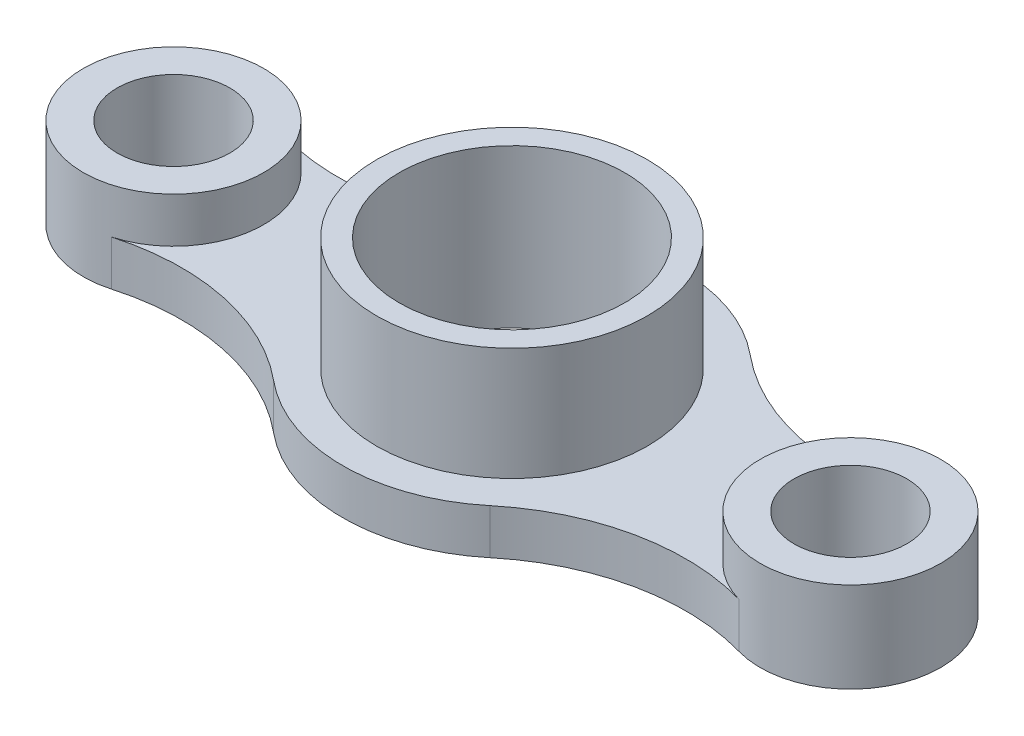
ISO-10303-21;
HEADER;
FILE_DESCRIPTION(('STEP AP214'),'2;1');
FILE_NAME('part.step','',(''),(''),'','','');
FILE_SCHEMA(('AUTOMOTIVE_DESIGN { 1 0 10303 214 1 1 1 1 }'));
ENDSEC;
DATA;
#1=APPLICATION_CONTEXT('core data for automotive mechanical design processes');
#2=APPLICATION_PROTOCOL_DEFINITION('international standard','automotive_design',2000,#1);
#3=PRODUCT_CONTEXT('',#1,'mechanical');
#4=PRODUCT('Part','Part','',(#3));
#5=PRODUCT_RELATED_PRODUCT_CATEGORY('part','',(#4));
#6=PRODUCT_DEFINITION_FORMATION('','',#4);
#7=PRODUCT_DEFINITION_CONTEXT('part definition',#1,'design');
#8=PRODUCT_DEFINITION('design','',#6,#7);
#9=PRODUCT_DEFINITION_SHAPE('','',#8);
#10=(LENGTH_UNIT() NAMED_UNIT(*) SI_UNIT(.MILLI.,.METRE.));
#11=(NAMED_UNIT(*) PLANE_ANGLE_UNIT() SI_UNIT($,.RADIAN.));
#12=(NAMED_UNIT(*) SI_UNIT($,.STERADIAN.) SOLID_ANGLE_UNIT());
#13=UNCERTAINTY_MEASURE_WITH_UNIT(LENGTH_MEASURE(1.E-05),#10,'distance_accuracy_value','');
#14=(GEOMETRIC_REPRESENTATION_CONTEXT(3) GLOBAL_UNCERTAINTY_ASSIGNED_CONTEXT((#13)) GLOBAL_UNIT_ASSIGNED_CONTEXT((#10,
#11,#12)) REPRESENTATION_CONTEXT('',''));
#15=CARTESIAN_POINT('',(0.,0.,0.));
#16=DIRECTION('',(0.,0.,1.));
#17=DIRECTION('',(1.,0.,0.));
#18=AXIS2_PLACEMENT_3D('',#15,#16,#17);
#19=CARTESIAN_POINT('',(-55.875,20.,-67.3367238214037));
#20=DIRECTION('',(0.,1.,0.));
#21=DIRECTION('',(0.,0.,1.));
#22=AXIS2_PLACEMENT_3D('',#19,#20,#21);
#23=PLANE('',#22);
#24=CARTESIAN_POINT('',(150.,20.,0.));
#25=DIRECTION('',(0.,-1.,0.));
#26=DIRECTION('',(0.,0.,1.));
#27=AXIS2_PLACEMENT_3D('',#24,#25,#26);
#28=CIRCLE('',#27,40.);
#29=CARTESIAN_POINT('',(139.071428571429,20.,38.478127897945));
#30=VERTEX_POINT('',#29);
#31=CARTESIAN_POINT('',(139.071428571429,20.,-38.478127897945));
#32=VERTEX_POINT('',#31);
#33=EDGE_CURVE('E341',#30,#32,#28,.T.);
#34=ORIENTED_EDGE('',*,*,#33,.T.);
#35=CARTESIAN_POINT('',(111.75,20.,-134.673447642807));
#36=DIRECTION('',(0.,-1.,0.));
#37=DIRECTION('',(0.,0.,-1.));
#38=AXIS2_PLACEMENT_3D('',#35,#36,#37);
#39=CIRCLE('',#38,100.);
#40=CARTESIAN_POINT('',(47.8928571428571,20.,-57.7171918469175));
#41=VERTEX_POINT('',#40);
#42=EDGE_CURVE('E220',#32,#41,#39,.T.);
#43=ORIENTED_EDGE('',*,*,#42,.T.);
#44=CARTESIAN_POINT('',(0.,20.,0.));
#45=DIRECTION('',(0.,1.,0.));
#46=DIRECTION('',(0.,0.,1.));
#47=AXIS2_PLACEMENT_3D('',#44,#45,#46);
#48=CIRCLE('',#47,75.);
#49=CARTESIAN_POINT('',(-47.8928571428571,20.,-57.7171918469175));
#50=VERTEX_POINT('',#49);
#51=EDGE_CURVE('E183',#41,#50,#48,.T.);
#52=ORIENTED_EDGE('',*,*,#51,.T.);
#53=CARTESIAN_POINT('',(-111.75,20.,-134.673447642807));
#54=DIRECTION('',(0.,1.,0.));
#55=DIRECTION('',(0.,0.,1.));
#56=AXIS2_PLACEMENT_3D('',#53,#54,#55);
#57=CIRCLE('',#56,100.);
#58=CARTESIAN_POINT('',(-139.071428571429,20.,-38.478127897945));
#59=VERTEX_POINT('',#58);
#60=EDGE_CURVE('E243',#59,#50,#57,.T.);
#61=ORIENTED_EDGE('',*,*,#60,.F.);
#62=CARTESIAN_POINT('',(-150.,20.,0.));
#63=DIRECTION('',(0.,1.,0.));
#64=DIRECTION('',(0.,0.,1.));
#65=AXIS2_PLACEMENT_3D('',#62,#63,#64);
#66=CIRCLE('',#65,40.);
#67=CARTESIAN_POINT('',(-139.071428571429,20.,38.478127897945));
#68=VERTEX_POINT('',#67);
#69=EDGE_CURVE('E264',#68,#59,#66,.T.);
#70=ORIENTED_EDGE('',*,*,#69,.F.);
#71=CARTESIAN_POINT('',(-111.75,20.,134.673447642807));
#72=DIRECTION('',(0.,-1.,0.));
#73=DIRECTION('',(0.,0.,-1.));
#74=AXIS2_PLACEMENT_3D('',#71,#72,#73);
#75=CIRCLE('',#74,100.);
#76=CARTESIAN_POINT('',(-47.8928571428571,20.,57.7171918469175));
#77=VERTEX_POINT('',#76);
#78=EDGE_CURVE('E202',#68,#77,#75,.T.);
#79=ORIENTED_EDGE('',*,*,#78,.T.);
#80=CARTESIAN_POINT('',(0.,20.,0.));
#81=DIRECTION('',(0.,1.,0.));
#82=DIRECTION('',(0.,0.,1.));
#83=AXIS2_PLACEMENT_3D('',#80,#81,#82);
#84=CIRCLE('',#83,75.);
#85=CARTESIAN_POINT('',(47.8928571428571,20.,57.7171918469175));
#86=VERTEX_POINT('',#85);
#87=EDGE_CURVE('E194',#77,#86,#84,.T.);
#88=ORIENTED_EDGE('',*,*,#87,.T.);
#89=CARTESIAN_POINT('',(111.75,20.,134.673447642807));
#90=DIRECTION('',(0.,1.,0.));
#91=DIRECTION('',(0.,0.,1.));
#92=AXIS2_PLACEMENT_3D('',#89,#90,#91);
#93=CIRCLE('',#92,100.);
#94=EDGE_CURVE('E199',#30,#86,#93,.T.);
#95=ORIENTED_EDGE('',*,*,#94,.F.);
#96=EDGE_LOOP('',(#34,#43,#52,#61,#70,#79,#88,#95));
#97=FACE_BOUND('',#96,.T.);
#98=CARTESIAN_POINT('',(0.,20.,0.));
#99=DIRECTION('',(0.,1.,0.));
#100=DIRECTION('',(0.,0.,1.));
#101=AXIS2_PLACEMENT_3D('',#98,#99,#100);
#102=CIRCLE('',#101,60.);
#103=CARTESIAN_POINT('',(0.,20.,60.));
#104=VERTEX_POINT('',#103);
#105=EDGE_CURVE('E230',#104,#104,#102,.T.);
#106=ORIENTED_EDGE('',*,*,#105,.F.);
#107=EDGE_LOOP('',(#106));
#108=FACE_BOUND('',#107,.T.);
#109=ADVANCED_FACE('F126',(#97,#108),#23,.T.);
#110=CARTESIAN_POINT('',(-55.875,0.,-67.3367238214037));
#111=DIRECTION('',(0.,1.,0.));
#112=DIRECTION('',(0.,0.,1.));
#113=AXIS2_PLACEMENT_3D('',#110,#111,#112);
#114=PLANE('',#113);
#115=CARTESIAN_POINT('',(150.,0.,0.));
#116=DIRECTION('',(0.,-1.,0.));
#117=DIRECTION('',(0.,0.,-1.));
#118=AXIS2_PLACEMENT_3D('',#115,#116,#117);
#119=CIRCLE('',#118,25.);
#120=CARTESIAN_POINT('',(150.,0.,-25.));
#121=VERTEX_POINT('',#120);
#122=EDGE_CURVE('E287',#121,#121,#119,.T.);
#123=ORIENTED_EDGE('',*,*,#122,.F.);
#124=EDGE_LOOP('',(#123));
#125=FACE_BOUND('',#124,.T.);
#126=CARTESIAN_POINT('',(-111.75,0.,-134.673447642807));
#127=DIRECTION('',(0.,1.,0.));
#128=DIRECTION('',(0.,0.,1.));
#129=AXIS2_PLACEMENT_3D('',#126,#127,#128);
#130=CIRCLE('',#129,100.);
#131=CARTESIAN_POINT('',(-139.071428571429,0.,-38.478127897945));
#132=VERTEX_POINT('',#131);
#133=CARTESIAN_POINT('',(-47.8928571428571,0.,-57.7171918469175));
#134=VERTEX_POINT('',#133);
#135=EDGE_CURVE('E226',#132,#134,#130,.T.);
#136=ORIENTED_EDGE('',*,*,#135,.T.);
#137=CARTESIAN_POINT('',(0.,0.,0.));
#138=DIRECTION('',(0.,1.,0.));
#139=DIRECTION('',(0.,0.,1.));
#140=AXIS2_PLACEMENT_3D('',#137,#138,#139);
#141=CIRCLE('',#140,75.);
#142=CARTESIAN_POINT('',(47.8928571428571,0.,-57.7171918469175));
#143=VERTEX_POINT('',#142);
#144=EDGE_CURVE('E229',#143,#134,#141,.T.);
#145=ORIENTED_EDGE('',*,*,#144,.F.);
#146=CARTESIAN_POINT('',(111.75,0.,-134.673447642807));
#147=DIRECTION('',(0.,-1.,0.));
#148=DIRECTION('',(0.,0.,-1.));
#149=AXIS2_PLACEMENT_3D('',#146,#147,#148);
#150=CIRCLE('',#149,100.);
#151=CARTESIAN_POINT('',(139.071428571429,0.,-38.478127897945));
#152=VERTEX_POINT('',#151);
#153=EDGE_CURVE('E233',#152,#143,#150,.T.);
#154=ORIENTED_EDGE('',*,*,#153,.F.);
#155=CARTESIAN_POINT('',(150.,0.,0.));
#156=DIRECTION('',(0.,-1.,0.));
#157=DIRECTION('',(0.,0.,-1.));
#158=AXIS2_PLACEMENT_3D('',#155,#156,#157);
#159=CIRCLE('',#158,40.);
#160=CARTESIAN_POINT('',(139.071428571429,0.,38.478127897945));
#161=VERTEX_POINT('',#160);
#162=EDGE_CURVE('E235',#152,#161,#159,.T.);
#163=ORIENTED_EDGE('',*,*,#162,.T.);
#164=CARTESIAN_POINT('',(111.75,0.,134.673447642807));
#165=DIRECTION('',(0.,1.,0.));
#166=DIRECTION('',(0.,0.,1.));
#167=AXIS2_PLACEMENT_3D('',#164,#165,#166);
#168=CIRCLE('',#167,100.);
#169=CARTESIAN_POINT('',(47.8928571428571,0.,57.7171918469175));
#170=VERTEX_POINT('',#169);
#171=EDGE_CURVE('E238',#161,#170,#168,.T.);
#172=ORIENTED_EDGE('',*,*,#171,.T.);
#173=CARTESIAN_POINT('',(0.,0.,0.));
#174=DIRECTION('',(0.,1.,0.));
#175=DIRECTION('',(0.,0.,1.));
#176=AXIS2_PLACEMENT_3D('',#173,#174,#175);
#177=CIRCLE('',#176,75.);
#178=CARTESIAN_POINT('',(-47.8928571428571,0.,57.7171918469175));
#179=VERTEX_POINT('',#178);
#180=EDGE_CURVE('E211',#179,#170,#177,.T.);
#181=ORIENTED_EDGE('',*,*,#180,.F.);
#182=CARTESIAN_POINT('',(-111.75,0.,134.673447642807));
#183=DIRECTION('',(0.,-1.,0.));
#184=DIRECTION('',(0.,0.,-1.));
#185=AXIS2_PLACEMENT_3D('',#182,#183,#184);
#186=CIRCLE('',#185,100.);
#187=CARTESIAN_POINT('',(-139.071428571429,0.,38.478127897945));
#188=VERTEX_POINT('',#187);
#189=EDGE_CURVE('E241',#188,#179,#186,.T.);
#190=ORIENTED_EDGE('',*,*,#189,.F.);
#191=CARTESIAN_POINT('',(-150.,0.,0.));
#192=DIRECTION('',(0.,1.,0.));
#193=DIRECTION('',(0.,0.,1.));
#194=AXIS2_PLACEMENT_3D('',#191,#192,#193);
#195=CIRCLE('',#194,40.);
#196=EDGE_CURVE('E173',#132,#188,#195,.T.);
#197=ORIENTED_EDGE('',*,*,#196,.F.);
#198=EDGE_LOOP('',(#136,#145,#154,#163,#172,#181,#190,#197));
#199=FACE_BOUND('',#198,.T.);
#200=CARTESIAN_POINT('',(-150.,0.,0.));
#201=DIRECTION('',(0.,1.,0.));
#202=DIRECTION('',(0.,0.,1.));
#203=AXIS2_PLACEMENT_3D('',#200,#201,#202);
#204=CIRCLE('',#203,25.);
#205=CARTESIAN_POINT('',(-150.,0.,25.));
#206=VERTEX_POINT('',#205);
#207=EDGE_CURVE('E284',#206,#206,#204,.T.);
#208=ORIENTED_EDGE('',*,*,#207,.T.);
#209=EDGE_LOOP('',(#208));
#210=FACE_BOUND('',#209,.T.);
#211=CARTESIAN_POINT('',(0.,0.,0.));
#212=DIRECTION('',(0.,1.,0.));
#213=DIRECTION('',(0.,0.,1.));
#214=AXIS2_PLACEMENT_3D('',#211,#212,#213);
#215=CIRCLE('',#214,50.);
#216=CARTESIAN_POINT('',(0.,0.,50.));
#217=VERTEX_POINT('',#216);
#218=EDGE_CURVE('E270',#217,#217,#215,.T.);
#219=ORIENTED_EDGE('',*,*,#218,.T.);
#220=EDGE_LOOP('',(#219));
#221=FACE_BOUND('',#220,.T.);
#222=ADVANCED_FACE('F257',(#125,#199,#210,#221),#114,.F.);
#223=CARTESIAN_POINT('',(-111.75,20.,-134.673447642807));
#224=DIRECTION('',(0.,-1.,0.));
#225=DIRECTION('',(0.,0.,-1.));
#226=AXIS2_PLACEMENT_3D('',#223,#224,#225);
#227=CYLINDRICAL_SURFACE('',#226,100.);
#228=ORIENTED_EDGE('',*,*,#135,.F.);
#229=DIRECTION('',(0.,-1.,0.));
#230=VECTOR('',#229,1.);
#231=CARTESIAN_POINT('',(-139.071428571429,20.,-38.478127897945));
#232=LINE('',#231,#230);
#233=EDGE_CURVE('E12',#59,#132,#232,.T.);
#234=ORIENTED_EDGE('',*,*,#233,.F.);
#235=ORIENTED_EDGE('',*,*,#60,.T.);
#236=DIRECTION('',(0.,-1.,0.));
#237=VECTOR('',#236,1.);
#238=CARTESIAN_POINT('',(-47.8928571428571,20.,-57.7171918469175));
#239=LINE('',#238,#237);
#240=EDGE_CURVE('E130',#50,#134,#239,.T.);
#241=ORIENTED_EDGE('',*,*,#240,.T.);
#242=EDGE_LOOP('',(#228,#234,#235,#241));
#243=FACE_BOUND('',#242,.T.);
#244=ADVANCED_FACE('F128',(#243),#227,.F.);
#245=CARTESIAN_POINT('',(-150.,20.,0.));
#246=DIRECTION('',(0.,-1.,0.));
#247=DIRECTION('',(0.,0.,-1.));
#248=AXIS2_PLACEMENT_3D('',#245,#246,#247);
#249=CYLINDRICAL_SURFACE('',#248,40.);
#250=ORIENTED_EDGE('',*,*,#196,.T.);
#251=DIRECTION('',(0.,-1.,0.));
#252=VECTOR('',#251,1.);
#253=CARTESIAN_POINT('',(-139.071428571429,20.,38.478127897945));
#254=LINE('',#253,#252);
#255=EDGE_CURVE('E136',#68,#188,#254,.T.);
#256=ORIENTED_EDGE('',*,*,#255,.F.);
#257=ORIENTED_EDGE('',*,*,#69,.T.);
#258=ORIENTED_EDGE('',*,*,#233,.T.);
#259=EDGE_LOOP('',(#250,#256,#257,#258));
#260=FACE_BOUND('',#259,.T.);
#261=CARTESIAN_POINT('',(-150.,40.,0.));
#262=DIRECTION('',(0.,1.,0.));
#263=DIRECTION('',(0.,0.,1.));
#264=AXIS2_PLACEMENT_3D('',#261,#262,#263);
#265=CIRCLE('',#264,40.);
#266=CARTESIAN_POINT('',(-150.,40.,40.));
#267=VERTEX_POINT('',#266);
#268=EDGE_CURVE('E266',#267,#267,#265,.T.);
#269=ORIENTED_EDGE('',*,*,#268,.F.);
#270=EDGE_LOOP('',(#269));
#271=FACE_BOUND('',#270,.T.);
#272=ADVANCED_FACE('F262',(#260,#271),#249,.T.);
#273=CARTESIAN_POINT('',(-111.75,20.,134.673447642807));
#274=DIRECTION('',(0.,-1.,0.));
#275=DIRECTION('',(0.,0.,-1.));
#276=AXIS2_PLACEMENT_3D('',#273,#274,#275);
#277=CYLINDRICAL_SURFACE('',#276,100.);
#278=ORIENTED_EDGE('',*,*,#189,.T.);
#279=DIRECTION('',(0.,-1.,0.));
#280=VECTOR('',#279,1.);
#281=CARTESIAN_POINT('',(-47.8928571428571,20.,57.7171918469175));
#282=LINE('',#281,#280);
#283=EDGE_CURVE('E215',#77,#179,#282,.T.);
#284=ORIENTED_EDGE('',*,*,#283,.F.);
#285=ORIENTED_EDGE('',*,*,#78,.F.);
#286=ORIENTED_EDGE('',*,*,#255,.T.);
#287=EDGE_LOOP('',(#278,#284,#285,#286));
#288=FACE_BOUND('',#287,.T.);
#289=ADVANCED_FACE('F261',(#288),#277,.F.);
#290=CARTESIAN_POINT('',(0.,20.,0.));
#291=DIRECTION('',(0.,-1.,0.));
#292=DIRECTION('',(0.,0.,-1.));
#293=AXIS2_PLACEMENT_3D('',#290,#291,#292);
#294=CYLINDRICAL_SURFACE('',#293,75.);
#295=ORIENTED_EDGE('',*,*,#180,.T.);
#296=DIRECTION('',(0.,-1.,0.));
#297=VECTOR('',#296,1.);
#298=CARTESIAN_POINT('',(47.8928571428571,20.,57.7171918469175));
#299=LINE('',#298,#297);
#300=EDGE_CURVE('E208',#86,#170,#299,.T.);
#301=ORIENTED_EDGE('',*,*,#300,.F.);
#302=ORIENTED_EDGE('',*,*,#87,.F.);
#303=ORIENTED_EDGE('',*,*,#283,.T.);
#304=EDGE_LOOP('',(#295,#301,#302,#303));
#305=FACE_BOUND('',#304,.T.);
#306=ADVANCED_FACE('F209',(#305),#294,.T.);
#307=CARTESIAN_POINT('',(111.75,20.,134.673447642807));
#308=DIRECTION('',(0.,-1.,0.));
#309=DIRECTION('',(0.,0.,-1.));
#310=AXIS2_PLACEMENT_3D('',#307,#308,#309);
#311=CYLINDRICAL_SURFACE('',#310,100.);
#312=ORIENTED_EDGE('',*,*,#171,.F.);
#313=DIRECTION('',(0.,-1.,0.));
#314=VECTOR('',#313,1.);
#315=CARTESIAN_POINT('',(139.071428571429,20.,38.478127897945));
#316=LINE('',#315,#314);
#317=EDGE_CURVE('E216',#30,#161,#316,.T.);
#318=ORIENTED_EDGE('',*,*,#317,.F.);
#319=ORIENTED_EDGE('',*,*,#94,.T.);
#320=ORIENTED_EDGE('',*,*,#300,.T.);
#321=EDGE_LOOP('',(#312,#318,#319,#320));
#322=FACE_BOUND('',#321,.T.);
#323=ADVANCED_FACE('F219',(#322),#311,.F.);
#324=CARTESIAN_POINT('',(150.,20.,0.));
#325=DIRECTION('',(0.,-1.,0.));
#326=DIRECTION('',(0.,0.,-1.));
#327=AXIS2_PLACEMENT_3D('',#324,#325,#326);
#328=CYLINDRICAL_SURFACE('',#327,40.);
#329=ORIENTED_EDGE('',*,*,#162,.F.);
#330=DIRECTION('',(0.,-1.,0.));
#331=VECTOR('',#330,1.);
#332=CARTESIAN_POINT('',(139.071428571429,20.,-38.478127897945));
#333=LINE('',#332,#331);
#334=EDGE_CURVE('E248',#32,#152,#333,.T.);
#335=ORIENTED_EDGE('',*,*,#334,.F.);
#336=ORIENTED_EDGE('',*,*,#33,.F.);
#337=ORIENTED_EDGE('',*,*,#317,.T.);
#338=EDGE_LOOP('',(#329,#335,#336,#337));
#339=FACE_BOUND('',#338,.T.);
#340=CARTESIAN_POINT('',(150.,40.,0.));
#341=DIRECTION('',(0.,-1.,0.));
#342=DIRECTION('',(0.,0.,1.));
#343=AXIS2_PLACEMENT_3D('',#340,#341,#342);
#344=CIRCLE('',#343,40.);
#345=CARTESIAN_POINT('',(150.,40.,40.));
#346=VERTEX_POINT('',#345);
#347=EDGE_CURVE('E273',#346,#346,#344,.T.);
#348=ORIENTED_EDGE('',*,*,#347,.T.);
#349=EDGE_LOOP('',(#348));
#350=FACE_BOUND('',#349,.T.);
#351=ADVANCED_FACE('F316',(#339,#350),#328,.T.);
#352=CARTESIAN_POINT('',(111.75,20.,-134.673447642807));
#353=DIRECTION('',(0.,-1.,0.));
#354=DIRECTION('',(0.,0.,-1.));
#355=AXIS2_PLACEMENT_3D('',#352,#353,#354);
#356=CYLINDRICAL_SURFACE('',#355,100.);
#357=ORIENTED_EDGE('',*,*,#153,.T.);
#358=DIRECTION('',(0.,-1.,0.));
#359=VECTOR('',#358,1.);
#360=CARTESIAN_POINT('',(47.8928571428571,20.,-57.7171918469175));
#361=LINE('',#360,#359);
#362=EDGE_CURVE('E249',#41,#143,#361,.T.);
#363=ORIENTED_EDGE('',*,*,#362,.F.);
#364=ORIENTED_EDGE('',*,*,#42,.F.);
#365=ORIENTED_EDGE('',*,*,#334,.T.);
#366=EDGE_LOOP('',(#357,#363,#364,#365));
#367=FACE_BOUND('',#366,.T.);
#368=ADVANCED_FACE('F319',(#367),#356,.F.);
#369=CARTESIAN_POINT('',(0.,20.,0.));
#370=DIRECTION('',(0.,-1.,0.));
#371=DIRECTION('',(0.,0.,-1.));
#372=AXIS2_PLACEMENT_3D('',#369,#370,#371);
#373=CYLINDRICAL_SURFACE('',#372,75.);
#374=ORIENTED_EDGE('',*,*,#144,.T.);
#375=ORIENTED_EDGE('',*,*,#240,.F.);
#376=ORIENTED_EDGE('',*,*,#51,.F.);
#377=ORIENTED_EDGE('',*,*,#362,.T.);
#378=EDGE_LOOP('',(#374,#375,#376,#377));
#379=FACE_BOUND('',#378,.T.);
#380=ADVANCED_FACE('F254',(#379),#373,.T.);
#381=CARTESIAN_POINT('',(150.,20.,0.));
#382=DIRECTION('',(0.,-1.,0.));
#383=DIRECTION('',(0.,0.,-1.));
#384=AXIS2_PLACEMENT_3D('',#381,#382,#383);
#385=CYLINDRICAL_SURFACE('',#384,25.);
#386=ORIENTED_EDGE('',*,*,#122,.T.);
#387=EDGE_LOOP('',(#386));
#388=FACE_BOUND('',#387,.T.);
#389=CARTESIAN_POINT('',(150.,40.,0.));
#390=DIRECTION('',(0.,-1.,0.));
#391=DIRECTION('',(0.,0.,1.));
#392=AXIS2_PLACEMENT_3D('',#389,#390,#391);
#393=CIRCLE('',#392,25.);
#394=CARTESIAN_POINT('',(150.,40.,25.));
#395=VERTEX_POINT('',#394);
#396=EDGE_CURVE('E339',#395,#395,#393,.T.);
#397=ORIENTED_EDGE('',*,*,#396,.F.);
#398=EDGE_LOOP('',(#397));
#399=FACE_BOUND('',#398,.T.);
#400=ADVANCED_FACE('F306',(#388,#399),#385,.F.);
#401=CARTESIAN_POINT('',(-150.,20.,0.));
#402=DIRECTION('',(0.,-1.,0.));
#403=DIRECTION('',(0.,0.,-1.));
#404=AXIS2_PLACEMENT_3D('',#401,#402,#403);
#405=CYLINDRICAL_SURFACE('',#404,25.);
#406=ORIENTED_EDGE('',*,*,#207,.F.);
#407=EDGE_LOOP('',(#406));
#408=FACE_BOUND('',#407,.T.);
#409=CARTESIAN_POINT('',(-150.,40.,0.));
#410=DIRECTION('',(0.,1.,0.));
#411=DIRECTION('',(0.,0.,1.));
#412=AXIS2_PLACEMENT_3D('',#409,#410,#411);
#413=CIRCLE('',#412,25.);
#414=CARTESIAN_POINT('',(-150.,40.,25.));
#415=VERTEX_POINT('',#414);
#416=EDGE_CURVE('E267',#415,#415,#413,.T.);
#417=ORIENTED_EDGE('',*,*,#416,.T.);
#418=EDGE_LOOP('',(#417));
#419=FACE_BOUND('',#418,.T.);
#420=ADVANCED_FACE('F327',(#408,#419),#405,.F.);
#421=CARTESIAN_POINT('',(0.,70.,0.));
#422=DIRECTION('',(0.,1.,0.));
#423=DIRECTION('',(0.,0.,1.));
#424=AXIS2_PLACEMENT_3D('',#421,#422,#423);
#425=PLANE('',#424);
#426=CARTESIAN_POINT('',(0.,70.,0.));
#427=DIRECTION('',(0.,1.,0.));
#428=DIRECTION('',(0.,0.,1.));
#429=AXIS2_PLACEMENT_3D('',#426,#427,#428);
#430=CIRCLE('',#429,60.);
#431=CARTESIAN_POINT('',(0.,70.,60.));
#432=VERTEX_POINT('',#431);
#433=EDGE_CURVE('E279',#432,#432,#430,.T.);
#434=ORIENTED_EDGE('',*,*,#433,.T.);
#435=EDGE_LOOP('',(#434));
#436=FACE_BOUND('',#435,.T.);
#437=CARTESIAN_POINT('',(0.,70.,0.));
#438=DIRECTION('',(0.,1.,0.));
#439=DIRECTION('',(0.,0.,1.));
#440=AXIS2_PLACEMENT_3D('',#437,#438,#439);
#441=CIRCLE('',#440,50.);
#442=CARTESIAN_POINT('',(0.,70.,50.));
#443=VERTEX_POINT('',#442);
#444=EDGE_CURVE('E276',#443,#443,#441,.T.);
#445=ORIENTED_EDGE('',*,*,#444,.F.);
#446=EDGE_LOOP('',(#445));
#447=FACE_BOUND('',#446,.T.);
#448=ADVANCED_FACE('F333',(#436,#447),#425,.T.);
#449=CARTESIAN_POINT('',(0.,70.,0.));
#450=DIRECTION('',(0.,-1.,0.));
#451=DIRECTION('',(0.,0.,-1.));
#452=AXIS2_PLACEMENT_3D('',#449,#450,#451);
#453=CYLINDRICAL_SURFACE('',#452,60.);
#454=ORIENTED_EDGE('',*,*,#105,.T.);
#455=EDGE_LOOP('',(#454));
#456=FACE_BOUND('',#455,.T.);
#457=ORIENTED_EDGE('',*,*,#433,.F.);
#458=EDGE_LOOP('',(#457));
#459=FACE_BOUND('',#458,.T.);
#460=ADVANCED_FACE('F294',(#456,#459),#453,.T.);
#461=CARTESIAN_POINT('',(0.,70.,0.));
#462=DIRECTION('',(0.,-1.,0.));
#463=DIRECTION('',(0.,0.,-1.));
#464=AXIS2_PLACEMENT_3D('',#461,#462,#463);
#465=CYLINDRICAL_SURFACE('',#464,50.);
#466=ORIENTED_EDGE('',*,*,#444,.T.);
#467=EDGE_LOOP('',(#466));
#468=FACE_BOUND('',#467,.T.);
#469=ORIENTED_EDGE('',*,*,#218,.F.);
#470=EDGE_LOOP('',(#469));
#471=FACE_BOUND('',#470,.T.);
#472=ADVANCED_FACE('F354',(#468,#471),#465,.F.);
#473=CARTESIAN_POINT('',(-150.,40.,0.));
#474=DIRECTION('',(0.,1.,0.));
#475=DIRECTION('',(0.,0.,1.));
#476=AXIS2_PLACEMENT_3D('',#473,#474,#475);
#477=PLANE('',#476);
#478=ORIENTED_EDGE('',*,*,#268,.T.);
#479=EDGE_LOOP('',(#478));
#480=FACE_BOUND('',#479,.T.);
#481=ORIENTED_EDGE('',*,*,#416,.F.);
#482=EDGE_LOOP('',(#481));
#483=FACE_BOUND('',#482,.T.);
#484=ADVANCED_FACE('F350',(#480,#483),#477,.T.);
#485=CARTESIAN_POINT('',(150.,40.,0.));
#486=DIRECTION('',(0.,1.,0.));
#487=DIRECTION('',(0.,0.,1.));
#488=AXIS2_PLACEMENT_3D('',#485,#486,#487);
#489=PLANE('',#488);
#490=ORIENTED_EDGE('',*,*,#396,.T.);
#491=EDGE_LOOP('',(#490));
#492=FACE_BOUND('',#491,.T.);
#493=ORIENTED_EDGE('',*,*,#347,.F.);
#494=EDGE_LOOP('',(#493));
#495=FACE_BOUND('',#494,.T.);
#496=ADVANCED_FACE('F349',(#492,#495),#489,.T.);
#497=CLOSED_SHELL('',(#109,#222,#244,#272,#289,#306,#323,#351,#368,#380,#400,#420,#448,#460,
#472,#484,#496));
#498=MANIFOLD_SOLID_BREP('B2',#497);
#499=ADVANCED_BREP_SHAPE_REPRESENTATION('',(#18,#498),#14);
#500=SHAPE_DEFINITION_REPRESENTATION(#9,#499);
ENDSEC;
END-ISO-10303-21;
